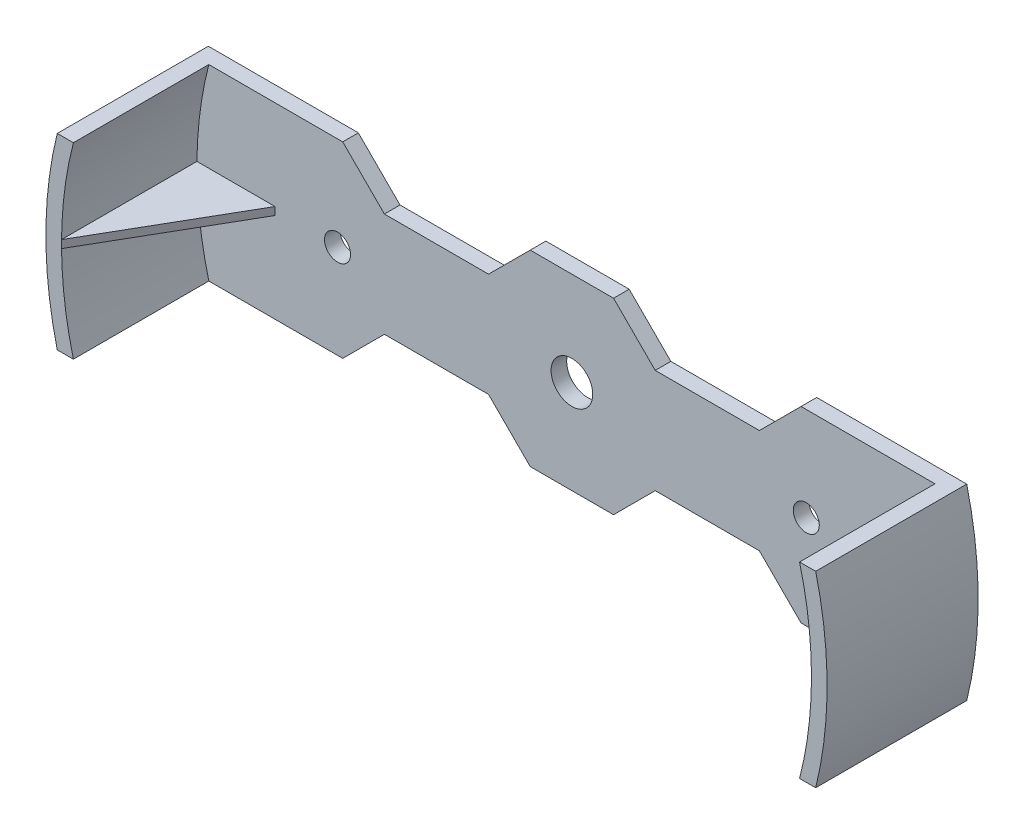
ISO-10303-21;
HEADER;
FILE_DESCRIPTION(('STEP AP214'),'2;1');
FILE_NAME('part.step','',(''),(''),'','','');
FILE_SCHEMA(('AUTOMOTIVE_DESIGN { 1 0 10303 214 1 1 1 1 }'));
ENDSEC;
DATA;
#1=APPLICATION_CONTEXT('core data for automotive mechanical design processes');
#2=APPLICATION_PROTOCOL_DEFINITION('international standard','automotive_design',2000,#1);
#3=PRODUCT_CONTEXT('',#1,'mechanical');
#4=PRODUCT('Part','Part','',(#3));
#5=PRODUCT_RELATED_PRODUCT_CATEGORY('part','',(#4));
#6=PRODUCT_DEFINITION_FORMATION('','',#4);
#7=PRODUCT_DEFINITION_CONTEXT('part definition',#1,'design');
#8=PRODUCT_DEFINITION('design','',#6,#7);
#9=PRODUCT_DEFINITION_SHAPE('','',#8);
#10=(LENGTH_UNIT() NAMED_UNIT(*) SI_UNIT(.MILLI.,.METRE.));
#11=(NAMED_UNIT(*) PLANE_ANGLE_UNIT() SI_UNIT($,.RADIAN.));
#12=(NAMED_UNIT(*) SI_UNIT($,.STERADIAN.) SOLID_ANGLE_UNIT());
#13=UNCERTAINTY_MEASURE_WITH_UNIT(LENGTH_MEASURE(1.E-05),#10,'distance_accuracy_value','');
#14=(GEOMETRIC_REPRESENTATION_CONTEXT(3) GLOBAL_UNCERTAINTY_ASSIGNED_CONTEXT((#13)) GLOBAL_UNIT_ASSIGNED_CONTEXT((#10,
#11,#12)) REPRESENTATION_CONTEXT('',''));
#15=CARTESIAN_POINT('',(0.,0.,0.));
#16=DIRECTION('',(0.,0.,1.));
#17=DIRECTION('',(1.,0.,0.));
#18=AXIS2_PLACEMENT_3D('',#15,#16,#17);
#19=CARTESIAN_POINT('',(0.,0.,29.));
#20=DIRECTION('',(0.,0.,-1.));
#21=DIRECTION('',(-1.,0.,0.));
#22=AXIS2_PLACEMENT_3D('',#19,#20,#21);
#23=CYLINDRICAL_SURFACE('',#22,72.);
#24=CARTESIAN_POINT('',(0.,0.,29.));
#25=DIRECTION('',(0.,0.,1.));
#26=DIRECTION('',(1.,0.,0.));
#27=AXIS2_PLACEMENT_3D('',#24,#25,#26);
#28=CIRCLE('',#27,72.);
#29=CARTESIAN_POINT('',(-69.7137002317335,18.,29.));
#30=VERTEX_POINT('',#29);
#31=CARTESIAN_POINT('',(-72.,0.,29.));
#32=VERTEX_POINT('',#31);
#33=EDGE_CURVE('E303',#30,#32,#28,.T.);
#34=ORIENTED_EDGE('',*,*,#33,.T.);
#35=CARTESIAN_POINT('',(0.,0.,-95.8));
#36=DIRECTION('',(-0.8661855860486,0.,-0.499722453489577));
#37=DIRECTION('',(0.499722453489577,0.,-0.866185586048601));
#38=AXIS2_PLACEMENT_3D('',#35,#36,#37);
#39=ELLIPSE('',#38,144.079977790115,72.);
#40=CARTESIAN_POINT('',(-71.9960936440305,0.75,28.9932289829861));
#41=VERTEX_POINT('',#40);
#42=EDGE_CURVE('E269',#32,#41,#39,.T.);
#43=ORIENTED_EDGE('',*,*,#42,.T.);
#44=DIRECTION('',(0.,0.,-1.));
#45=VECTOR('',#44,1.);
#46=CARTESIAN_POINT('',(-71.9960936440304,0.75,29.));
#47=LINE('',#46,#45);
#48=CARTESIAN_POINT('',(-71.9960936440305,0.75,3.));
#49=VERTEX_POINT('',#48);
#50=EDGE_CURVE('E262',#41,#49,#47,.T.);
#51=ORIENTED_EDGE('',*,*,#50,.T.);
#52=CARTESIAN_POINT('',(0.,0.,3.));
#53=DIRECTION('',(0.,0.,1.));
#54=DIRECTION('',(1.,0.,0.));
#55=AXIS2_PLACEMENT_3D('',#52,#53,#54);
#56=CIRCLE('',#55,72.);
#57=CARTESIAN_POINT('',(-69.7137002317335,18.,3.));
#58=VERTEX_POINT('',#57);
#59=EDGE_CURVE('E299',#58,#49,#56,.T.);
#60=ORIENTED_EDGE('',*,*,#59,.F.);
#61=DIRECTION('',(0.,0.,-1.));
#62=VECTOR('',#61,1.);
#63=CARTESIAN_POINT('',(-69.7137002317335,18.,29.));
#64=LINE('',#63,#62);
#65=EDGE_CURVE('E295',#30,#58,#64,.T.);
#66=ORIENTED_EDGE('',*,*,#65,.F.);
#67=EDGE_LOOP('',(#34,#43,#51,#60,#66));
#68=FACE_BOUND('',#67,.T.);
#69=ADVANCED_FACE('F38',(#68),#23,.F.);
#70=CARTESIAN_POINT('',(0.,0.,29.));
#71=DIRECTION('',(0.,0.,-1.));
#72=DIRECTION('',(-1.,0.,0.));
#73=AXIS2_PLACEMENT_3D('',#70,#71,#72);
#74=CYLINDRICAL_SURFACE('',#73,72.);
#75=DIRECTION('',(0.,0.,-1.));
#76=VECTOR('',#75,1.);
#77=CARTESIAN_POINT('',(71.9960936440304,-0.75,29.));
#78=LINE('',#77,#76);
#79=CARTESIAN_POINT('',(71.9960936440304,-0.75,3.));
#80=VERTEX_POINT('',#79);
#81=CARTESIAN_POINT('',(71.9960936440305,-0.75,28.9932289829861));
#82=VERTEX_POINT('',#81);
#83=EDGE_CURVE('E287',#80,#82,#78,.F.);
#84=ORIENTED_EDGE('',*,*,#83,.F.);
#85=CARTESIAN_POINT('',(0.,0.,3.));
#86=DIRECTION('',(0.,0.,1.));
#87=DIRECTION('',(1.,0.,0.));
#88=AXIS2_PLACEMENT_3D('',#85,#86,#87);
#89=CIRCLE('',#88,72.);
#90=CARTESIAN_POINT('',(69.7137002317335,-18.,3.));
#91=VERTEX_POINT('',#90);
#92=EDGE_CURVE('E329',#91,#80,#89,.T.);
#93=ORIENTED_EDGE('',*,*,#92,.F.);
#94=DIRECTION('',(0.,0.,-1.));
#95=VECTOR('',#94,1.);
#96=CARTESIAN_POINT('',(69.7137002317335,-18.,29.));
#97=LINE('',#96,#95);
#98=CARTESIAN_POINT('',(69.7137002317335,-18.,29.));
#99=VERTEX_POINT('',#98);
#100=EDGE_CURVE('E334',#99,#91,#97,.T.);
#101=ORIENTED_EDGE('',*,*,#100,.F.);
#102=CARTESIAN_POINT('',(0.,0.,29.));
#103=DIRECTION('',(0.,0.,1.));
#104=DIRECTION('',(1.,0.,0.));
#105=AXIS2_PLACEMENT_3D('',#102,#103,#104);
#106=CIRCLE('',#105,72.);
#107=CARTESIAN_POINT('',(72.,0.,29.));
#108=VERTEX_POINT('',#107);
#109=EDGE_CURVE('E315',#99,#108,#106,.T.);
#110=ORIENTED_EDGE('',*,*,#109,.T.);
#111=CARTESIAN_POINT('',(0.,0.,-95.8));
#112=DIRECTION('',(-0.8661855860486,0.,0.499722453489577));
#113=DIRECTION('',(-0.499722453489577,0.,-0.866185586048601));
#114=AXIS2_PLACEMENT_3D('',#111,#112,#113);
#115=ELLIPSE('',#114,144.079977790115,72.);
#116=EDGE_CURVE('E291',#82,#108,#115,.T.);
#117=ORIENTED_EDGE('',*,*,#116,.F.);
#118=EDGE_LOOP('',(#84,#93,#101,#110,#117));
#119=FACE_BOUND('',#118,.T.);
#120=ADVANCED_FACE('F593',(#119),#74,.F.);
#121=CARTESIAN_POINT('',(0.,0.,3.));
#122=DIRECTION('',(0.,0.,1.));
#123=DIRECTION('',(1.,0.,0.));
#124=AXIS2_PLACEMENT_3D('',#121,#122,#123);
#125=PLANE('',#124);
#126=DIRECTION('',(1.,0.,0.));
#127=VECTOR('',#126,1.);
#128=CARTESIAN_POINT('',(0.,-0.75,3.));
#129=LINE('',#128,#127);
#130=CARTESIAN_POINT('',(-71.9960936440304,-0.75,3.));
#131=VERTEX_POINT('',#130);
#132=CARTESIAN_POINT('',(-57.,-0.75,3.));
#133=VERTEX_POINT('',#132);
#134=EDGE_CURVE('E241',#131,#133,#129,.T.);
#135=ORIENTED_EDGE('',*,*,#134,.F.);
#136=CARTESIAN_POINT('',(-69.7137002317335,-18.,3.));
#137=VERTEX_POINT('',#136);
#138=EDGE_CURVE('E302',#131,#137,#56,.T.);
#139=ORIENTED_EDGE('',*,*,#138,.T.);
#140=DIRECTION('',(1.,0.,0.));
#141=VECTOR('',#140,1.);
#142=CARTESIAN_POINT('',(0.,-18.,3.));
#143=LINE('',#142,#141);
#144=CARTESIAN_POINT('',(-44.,-18.,3.));
#145=VERTEX_POINT('',#144);
#146=EDGE_CURVE('E349',#137,#145,#143,.T.);
#147=ORIENTED_EDGE('',*,*,#146,.T.);
#148=DIRECTION('',(-0.707106781186547,-0.707106781186548,0.));
#149=VECTOR('',#148,1.);
#150=CARTESIAN_POINT('',(-13.,13.,3.));
#151=LINE('',#150,#149);
#152=CARTESIAN_POINT('',(-36.,-10.,3.));
#153=VERTEX_POINT('',#152);
#154=EDGE_CURVE('E352',#153,#145,#151,.T.);
#155=ORIENTED_EDGE('',*,*,#154,.F.);
#156=DIRECTION('',(-1.,0.,0.));
#157=VECTOR('',#156,1.);
#158=CARTESIAN_POINT('',(0.,-10.,3.));
#159=LINE('',#158,#157);
#160=CARTESIAN_POINT('',(-16.,-10.,3.));
#161=VERTEX_POINT('',#160);
#162=EDGE_CURVE('E357',#161,#153,#159,.T.);
#163=ORIENTED_EDGE('',*,*,#162,.F.);
#164=DIRECTION('',(-0.707106781186547,0.707106781186548,0.));
#165=VECTOR('',#164,1.);
#166=CARTESIAN_POINT('',(-13.,-13.,3.));
#167=LINE('',#166,#165);
#168=CARTESIAN_POINT('',(-7.99999999999999,-18.,3.));
#169=VERTEX_POINT('',#168);
#170=EDGE_CURVE('E360',#169,#161,#167,.T.);
#171=ORIENTED_EDGE('',*,*,#170,.F.);
#172=CARTESIAN_POINT('',(7.99999999999999,-18.,3.));
#173=VERTEX_POINT('',#172);
#174=EDGE_CURVE('E354',#169,#173,#143,.T.);
#175=ORIENTED_EDGE('',*,*,#174,.T.);
#176=DIRECTION('',(0.707106781186547,0.707106781186548,0.));
#177=VECTOR('',#176,1.);
#178=CARTESIAN_POINT('',(13.,-13.,3.));
#179=LINE('',#178,#177);
#180=CARTESIAN_POINT('',(16.,-10.,3.));
#181=VERTEX_POINT('',#180);
#182=EDGE_CURVE('E363',#173,#181,#179,.T.);
#183=ORIENTED_EDGE('',*,*,#182,.T.);
#184=DIRECTION('',(1.,0.,0.));
#185=VECTOR('',#184,1.);
#186=CARTESIAN_POINT('',(0.,-10.,3.));
#187=LINE('',#186,#185);
#188=CARTESIAN_POINT('',(36.,-10.,3.));
#189=VERTEX_POINT('',#188);
#190=EDGE_CURVE('E366',#181,#189,#187,.T.);
#191=ORIENTED_EDGE('',*,*,#190,.T.);
#192=DIRECTION('',(0.707106781186547,-0.707106781186548,0.));
#193=VECTOR('',#192,1.);
#194=CARTESIAN_POINT('',(13.,13.,3.));
#195=LINE('',#194,#193);
#196=CARTESIAN_POINT('',(44.,-18.,3.));
#197=VERTEX_POINT('',#196);
#198=EDGE_CURVE('E369',#189,#197,#195,.T.);
#199=ORIENTED_EDGE('',*,*,#198,.T.);
#200=EDGE_CURVE('E353',#197,#91,#143,.T.);
#201=ORIENTED_EDGE('',*,*,#200,.T.);
#202=ORIENTED_EDGE('',*,*,#92,.T.);
#203=DIRECTION('',(-1.,0.,0.));
#204=VECTOR('',#203,1.);
#205=CARTESIAN_POINT('',(0.,-0.75,3.));
#206=LINE('',#205,#204);
#207=CARTESIAN_POINT('',(57.,-0.75,3.));
#208=VERTEX_POINT('',#207);
#209=EDGE_CURVE('E272',#80,#208,#206,.T.);
#210=ORIENTED_EDGE('',*,*,#209,.T.);
#211=DIRECTION('',(0.,1.,0.));
#212=VECTOR('',#211,1.);
#213=CARTESIAN_POINT('',(57.,-0.75,3.));
#214=LINE('',#213,#212);
#215=CARTESIAN_POINT('',(57.,0.75,3.));
#216=VERTEX_POINT('',#215);
#217=EDGE_CURVE('E278',#208,#216,#214,.T.);
#218=ORIENTED_EDGE('',*,*,#217,.T.);
#219=DIRECTION('',(-1.,0.,0.));
#220=VECTOR('',#219,1.);
#221=CARTESIAN_POINT('',(0.,0.75,3.));
#222=LINE('',#221,#220);
#223=CARTESIAN_POINT('',(71.9960936440304,0.75,3.));
#224=VERTEX_POINT('',#223);
#225=EDGE_CURVE('E279',#224,#216,#222,.T.);
#226=ORIENTED_EDGE('',*,*,#225,.F.);
#227=CARTESIAN_POINT('',(69.7137002317335,18.,3.));
#228=VERTEX_POINT('',#227);
#229=EDGE_CURVE('E301',#224,#228,#89,.T.);
#230=ORIENTED_EDGE('',*,*,#229,.T.);
#231=DIRECTION('',(1.,0.,0.));
#232=VECTOR('',#231,1.);
#233=CARTESIAN_POINT('',(0.,18.,3.));
#234=LINE('',#233,#232);
#235=CARTESIAN_POINT('',(44.,18.,3.));
#236=VERTEX_POINT('',#235);
#237=EDGE_CURVE('E372',#236,#228,#234,.T.);
#238=ORIENTED_EDGE('',*,*,#237,.F.);
#239=DIRECTION('',(0.707106781186546,0.707106781186549,0.));
#240=VECTOR('',#239,1.);
#241=CARTESIAN_POINT('',(13.0000000000001,-13.,3.));
#242=LINE('',#241,#240);
#243=CARTESIAN_POINT('',(36.,10.,3.));
#244=VERTEX_POINT('',#243);
#245=EDGE_CURVE('E375',#244,#236,#242,.T.);
#246=ORIENTED_EDGE('',*,*,#245,.F.);
#247=DIRECTION('',(1.,0.,0.));
#248=VECTOR('',#247,1.);
#249=CARTESIAN_POINT('',(0.,9.99999999999999,3.));
#250=LINE('',#249,#248);
#251=CARTESIAN_POINT('',(16.,10.,3.));
#252=VERTEX_POINT('',#251);
#253=EDGE_CURVE('E378',#252,#244,#250,.T.);
#254=ORIENTED_EDGE('',*,*,#253,.F.);
#255=DIRECTION('',(0.707106781186546,-0.707106781186549,0.));
#256=VECTOR('',#255,1.);
#257=CARTESIAN_POINT('',(13.,13.,3.));
#258=LINE('',#257,#256);
#259=CARTESIAN_POINT('',(7.99999999999999,18.,3.));
#260=VERTEX_POINT('',#259);
#261=EDGE_CURVE('E381',#260,#252,#258,.T.);
#262=ORIENTED_EDGE('',*,*,#261,.F.);
#263=DIRECTION('',(1.,0.,0.));
#264=VECTOR('',#263,1.);
#265=CARTESIAN_POINT('',(0.,18.,3.));
#266=LINE('',#265,#264);
#267=CARTESIAN_POINT('',(-7.99999999999999,18.,3.));
#268=VERTEX_POINT('',#267);
#269=EDGE_CURVE('E350',#268,#260,#266,.T.);
#270=ORIENTED_EDGE('',*,*,#269,.F.);
#271=DIRECTION('',(-0.707106781186547,-0.707106781186548,0.));
#272=VECTOR('',#271,1.);
#273=CARTESIAN_POINT('',(-13.,13.,3.));
#274=LINE('',#273,#272);
#275=CARTESIAN_POINT('',(-16.,9.99999999999999,3.));
#276=VERTEX_POINT('',#275);
#277=EDGE_CURVE('E384',#268,#276,#274,.T.);
#278=ORIENTED_EDGE('',*,*,#277,.T.);
#279=DIRECTION('',(-1.,0.,0.));
#280=VECTOR('',#279,1.);
#281=CARTESIAN_POINT('',(0.,10.,3.));
#282=LINE('',#281,#280);
#283=CARTESIAN_POINT('',(-36.,9.99999999999998,3.));
#284=VERTEX_POINT('',#283);
#285=EDGE_CURVE('E387',#276,#284,#282,.T.);
#286=ORIENTED_EDGE('',*,*,#285,.T.);
#287=DIRECTION('',(-0.707106781186547,0.707106781186548,0.));
#288=VECTOR('',#287,1.);
#289=CARTESIAN_POINT('',(-13.,-13.,3.));
#290=LINE('',#289,#288);
#291=CARTESIAN_POINT('',(-44.,18.,3.));
#292=VERTEX_POINT('',#291);
#293=EDGE_CURVE('E390',#284,#292,#290,.T.);
#294=ORIENTED_EDGE('',*,*,#293,.T.);
#295=EDGE_CURVE('E347',#58,#292,#266,.T.);
#296=ORIENTED_EDGE('',*,*,#295,.F.);
#297=ORIENTED_EDGE('',*,*,#59,.T.);
#298=DIRECTION('',(1.,0.,0.));
#299=VECTOR('',#298,1.);
#300=CARTESIAN_POINT('',(0.,0.75,3.));
#301=LINE('',#300,#299);
#302=CARTESIAN_POINT('',(-57.,0.75,3.));
#303=VERTEX_POINT('',#302);
#304=EDGE_CURVE('E53',#49,#303,#301,.T.);
#305=ORIENTED_EDGE('',*,*,#304,.T.);
#306=DIRECTION('',(0.,1.,0.));
#307=VECTOR('',#306,1.);
#308=CARTESIAN_POINT('',(-57.,-0.75,3.));
#309=LINE('',#308,#307);
#310=EDGE_CURVE('E255',#133,#303,#309,.T.);
#311=ORIENTED_EDGE('',*,*,#310,.F.);
#312=EDGE_LOOP('',(#135,#139,#147,#155,#163,#171,#175,#183,#191,#199,#201,#202,#210,#218,#226,
#230,#238,#246,#254,#262,#270,#278,#286,#294,#296,#297,#305,#311));
#313=FACE_BOUND('',#312,.T.);
#314=CARTESIAN_POINT('',(-45.,0.,3.));
#315=DIRECTION('',(0.,0.,1.));
#316=DIRECTION('',(1.,0.,0.));
#317=AXIS2_PLACEMENT_3D('',#314,#315,#316);
#318=CIRCLE('',#317,2.5);
#319=CARTESIAN_POINT('',(-42.5,0.,3.));
#320=VERTEX_POINT('',#319);
#321=EDGE_CURVE('E344',#320,#320,#318,.T.);
#322=ORIENTED_EDGE('',*,*,#321,.F.);
#323=EDGE_LOOP('',(#322));
#324=FACE_BOUND('',#323,.T.);
#325=CARTESIAN_POINT('',(45.,0.,3.));
#326=DIRECTION('',(0.,0.,1.));
#327=DIRECTION('',(1.,0.,0.));
#328=AXIS2_PLACEMENT_3D('',#325,#326,#327);
#329=CIRCLE('',#328,2.5);
#330=CARTESIAN_POINT('',(47.5,0.,3.));
#331=VERTEX_POINT('',#330);
#332=EDGE_CURVE('E340',#331,#331,#329,.T.);
#333=ORIENTED_EDGE('',*,*,#332,.F.);
#334=EDGE_LOOP('',(#333));
#335=FACE_BOUND('',#334,.T.);
#336=CARTESIAN_POINT('',(0.,0.,3.));
#337=DIRECTION('',(0.,0.,1.));
#338=DIRECTION('',(1.,0.,0.));
#339=AXIS2_PLACEMENT_3D('',#336,#337,#338);
#340=CIRCLE('',#339,4.);
#341=CARTESIAN_POINT('',(4.,0.,3.));
#342=VERTEX_POINT('',#341);
#343=EDGE_CURVE('E337',#342,#342,#340,.T.);
#344=ORIENTED_EDGE('',*,*,#343,.F.);
#345=EDGE_LOOP('',(#344));
#346=FACE_BOUND('',#345,.T.);
#347=ADVANCED_FACE('F259',(#313,#324,#335,#346),#125,.T.);
#348=CARTESIAN_POINT('',(0.,18.,3.));
#349=DIRECTION('',(0.,1.,0.));
#350=DIRECTION('',(0.,0.,1.));
#351=AXIS2_PLACEMENT_3D('',#348,#349,#350);
#352=PLANE('',#351);
#353=DIRECTION('',(1.,0.,0.));
#354=VECTOR('',#353,1.);
#355=CARTESIAN_POINT('',(0.,18.,0.));
#356=LINE('',#355,#354);
#357=CARTESIAN_POINT('',(-72.8079665970696,18.,0.));
#358=VERTEX_POINT('',#357);
#359=CARTESIAN_POINT('',(-44.,18.,0.));
#360=VERTEX_POINT('',#359);
#361=EDGE_CURVE('E402',#358,#360,#356,.T.);
#362=ORIENTED_EDGE('',*,*,#361,.F.);
#363=DIRECTION('',(0.,0.,-1.));
#364=VECTOR('',#363,1.);
#365=CARTESIAN_POINT('',(-72.8079665970696,18.,3.));
#366=LINE('',#365,#364);
#367=CARTESIAN_POINT('',(-72.8079665970696,18.,29.));
#368=VERTEX_POINT('',#367);
#369=EDGE_CURVE('E12',#368,#358,#366,.T.);
#370=ORIENTED_EDGE('',*,*,#369,.F.);
#371=DIRECTION('',(-1.,0.,0.));
#372=VECTOR('',#371,1.);
#373=CARTESIAN_POINT('',(-69.7137002317335,18.,29.));
#374=LINE('',#373,#372);
#375=EDGE_CURVE('E312',#30,#368,#374,.T.);
#376=ORIENTED_EDGE('',*,*,#375,.F.);
#377=ORIENTED_EDGE('',*,*,#65,.T.);
#378=ORIENTED_EDGE('',*,*,#295,.T.);
#379=DIRECTION('',(0.,0.,-1.));
#380=VECTOR('',#379,1.);
#381=CARTESIAN_POINT('',(-44.,18.,3.));
#382=LINE('',#381,#380);
#383=EDGE_CURVE('E393',#292,#360,#382,.T.);
#384=ORIENTED_EDGE('',*,*,#383,.T.);
#385=EDGE_LOOP('',(#362,#370,#376,#377,#378,#384));
#386=FACE_BOUND('',#385,.T.);
#387=ADVANCED_FACE('F508',(#386),#352,.T.);
#388=CARTESIAN_POINT('',(0.,0.,3.));
#389=DIRECTION('',(0.,0.,-1.));
#390=DIRECTION('',(-1.,0.,0.));
#391=AXIS2_PLACEMENT_3D('',#388,#389,#390);
#392=CYLINDRICAL_SURFACE('',#391,75.);
#393=CARTESIAN_POINT('',(0.,0.,0.));
#394=DIRECTION('',(0.,0.,1.));
#395=DIRECTION('',(1.,0.,0.));
#396=AXIS2_PLACEMENT_3D('',#393,#394,#395);
#397=CIRCLE('',#396,75.);
#398=CARTESIAN_POINT('',(-72.8079665970696,-18.,0.));
#399=VERTEX_POINT('',#398);
#400=EDGE_CURVE('E405',#358,#399,#397,.T.);
#401=ORIENTED_EDGE('',*,*,#400,.T.);
#402=DIRECTION('',(0.,0.,-1.));
#403=VECTOR('',#402,1.);
#404=CARTESIAN_POINT('',(-72.8079665970696,-18.,3.));
#405=LINE('',#404,#403);
#406=CARTESIAN_POINT('',(-72.8079665970696,-18.,29.));
#407=VERTEX_POINT('',#406);
#408=EDGE_CURVE('E46',#407,#399,#405,.T.);
#409=ORIENTED_EDGE('',*,*,#408,.F.);
#410=CARTESIAN_POINT('',(0.,0.,29.));
#411=DIRECTION('',(0.,0.,1.));
#412=DIRECTION('',(1.,0.,0.));
#413=AXIS2_PLACEMENT_3D('',#410,#411,#412);
#414=CIRCLE('',#413,75.);
#415=EDGE_CURVE('E309',#368,#407,#414,.T.);
#416=ORIENTED_EDGE('',*,*,#415,.F.);
#417=ORIENTED_EDGE('',*,*,#369,.T.);
#418=EDGE_LOOP('',(#401,#409,#416,#417));
#419=FACE_BOUND('',#418,.T.);
#420=ADVANCED_FACE('F503',(#419),#392,.T.);
#421=CARTESIAN_POINT('',(0.,-18.,3.));
#422=DIRECTION('',(0.,1.,0.));
#423=DIRECTION('',(0.,0.,1.));
#424=AXIS2_PLACEMENT_3D('',#421,#422,#423);
#425=PLANE('',#424);
#426=DIRECTION('',(1.,0.,0.));
#427=VECTOR('',#426,1.);
#428=CARTESIAN_POINT('',(0.,-18.,0.));
#429=LINE('',#428,#427);
#430=CARTESIAN_POINT('',(-44.,-18.,0.));
#431=VERTEX_POINT('',#430);
#432=EDGE_CURVE('E409',#399,#431,#429,.T.);
#433=ORIENTED_EDGE('',*,*,#432,.T.);
#434=DIRECTION('',(0.,0.,-1.));
#435=VECTOR('',#434,1.);
#436=CARTESIAN_POINT('',(-44.,-18.,3.));
#437=LINE('',#436,#435);
#438=EDGE_CURVE('E493',#145,#431,#437,.T.);
#439=ORIENTED_EDGE('',*,*,#438,.F.);
#440=ORIENTED_EDGE('',*,*,#146,.F.);
#441=DIRECTION('',(0.,0.,-1.));
#442=VECTOR('',#441,1.);
#443=CARTESIAN_POINT('',(-69.7137002317335,-18.,29.));
#444=LINE('',#443,#442);
#445=CARTESIAN_POINT('',(-69.7137002317335,-18.,29.));
#446=VERTEX_POINT('',#445);
#447=EDGE_CURVE('E292',#446,#137,#444,.T.);
#448=ORIENTED_EDGE('',*,*,#447,.F.);
#449=DIRECTION('',(1.,0.,0.));
#450=VECTOR('',#449,1.);
#451=CARTESIAN_POINT('',(-72.8079665970696,-18.,29.));
#452=LINE('',#451,#450);
#453=EDGE_CURVE('E306',#407,#446,#452,.T.);
#454=ORIENTED_EDGE('',*,*,#453,.F.);
#455=ORIENTED_EDGE('',*,*,#408,.T.);
#456=EDGE_LOOP('',(#433,#439,#440,#448,#454,#455));
#457=FACE_BOUND('',#456,.T.);
#458=ADVANCED_FACE('F497',(#457),#425,.F.);
#459=CARTESIAN_POINT('',(-13.,13.,3.));
#460=DIRECTION('',(0.707106781186548,-0.707106781186547,0.));
#461=DIRECTION('',(0.707106781186547,0.707106781186548,0.));
#462=AXIS2_PLACEMENT_3D('',#459,#460,#461);
#463=PLANE('',#462);
#464=DIRECTION('',(-0.707106781186547,-0.707106781186548,0.));
#465=VECTOR('',#464,1.);
#466=CARTESIAN_POINT('',(-13.,13.,0.));
#467=LINE('',#466,#465);
#468=CARTESIAN_POINT('',(-36.,-10.,0.));
#469=VERTEX_POINT('',#468);
#470=EDGE_CURVE('E413',#469,#431,#467,.T.);
#471=ORIENTED_EDGE('',*,*,#470,.F.);
#472=DIRECTION('',(0.,0.,-1.));
#473=VECTOR('',#472,1.);
#474=CARTESIAN_POINT('',(-36.,-10.,3.));
#475=LINE('',#474,#473);
#476=EDGE_CURVE('E491',#153,#469,#475,.T.);
#477=ORIENTED_EDGE('',*,*,#476,.F.);
#478=ORIENTED_EDGE('',*,*,#154,.T.);
#479=ORIENTED_EDGE('',*,*,#438,.T.);
#480=EDGE_LOOP('',(#471,#477,#478,#479));
#481=FACE_BOUND('',#480,.T.);
#482=ADVANCED_FACE('F567',(#481),#463,.T.);
#483=CARTESIAN_POINT('',(0.,-10.,3.));
#484=DIRECTION('',(0.,-1.,0.));
#485=DIRECTION('',(1.,0.,0.));
#486=AXIS2_PLACEMENT_3D('',#483,#484,#485);
#487=PLANE('',#486);
#488=DIRECTION('',(-1.,0.,0.));
#489=VECTOR('',#488,1.);
#490=CARTESIAN_POINT('',(0.,-10.,0.));
#491=LINE('',#490,#489);
#492=CARTESIAN_POINT('',(-16.,-10.,0.));
#493=VERTEX_POINT('',#492);
#494=EDGE_CURVE('E418',#493,#469,#491,.T.);
#495=ORIENTED_EDGE('',*,*,#494,.F.);
#496=DIRECTION('',(0.,0.,-1.));
#497=VECTOR('',#496,1.);
#498=CARTESIAN_POINT('',(-16.,-10.,3.));
#499=LINE('',#498,#497);
#500=EDGE_CURVE('E489',#161,#493,#499,.T.);
#501=ORIENTED_EDGE('',*,*,#500,.F.);
#502=ORIENTED_EDGE('',*,*,#162,.T.);
#503=ORIENTED_EDGE('',*,*,#476,.T.);
#504=EDGE_LOOP('',(#495,#501,#502,#503));
#505=FACE_BOUND('',#504,.T.);
#506=ADVANCED_FACE('F564',(#505),#487,.T.);
#507=CARTESIAN_POINT('',(-13.,-13.,3.));
#508=DIRECTION('',(-0.707106781186548,-0.707106781186547,0.));
#509=DIRECTION('',(0.707106781186547,-0.707106781186548,0.));
#510=AXIS2_PLACEMENT_3D('',#507,#508,#509);
#511=PLANE('',#510);
#512=DIRECTION('',(-0.707106781186547,0.707106781186548,0.));
#513=VECTOR('',#512,1.);
#514=CARTESIAN_POINT('',(-13.,-13.,0.));
#515=LINE('',#514,#513);
#516=CARTESIAN_POINT('',(-7.99999999999999,-18.,0.));
#517=VERTEX_POINT('',#516);
#518=EDGE_CURVE('E421',#517,#493,#515,.T.);
#519=ORIENTED_EDGE('',*,*,#518,.F.);
#520=DIRECTION('',(0.,0.,-1.));
#521=VECTOR('',#520,1.);
#522=CARTESIAN_POINT('',(-7.99999999999999,-18.,3.));
#523=LINE('',#522,#521);
#524=EDGE_CURVE('E487',#169,#517,#523,.T.);
#525=ORIENTED_EDGE('',*,*,#524,.F.);
#526=ORIENTED_EDGE('',*,*,#170,.T.);
#527=ORIENTED_EDGE('',*,*,#500,.T.);
#528=EDGE_LOOP('',(#519,#525,#526,#527));
#529=FACE_BOUND('',#528,.T.);
#530=ADVANCED_FACE('F559',(#529),#511,.T.);
#531=CARTESIAN_POINT('',(7.99999999999999,-18.,0.));
#532=VERTEX_POINT('',#531);
#533=EDGE_CURVE('E415',#517,#532,#429,.T.);
#534=ORIENTED_EDGE('',*,*,#533,.T.);
#535=DIRECTION('',(0.,0.,-1.));
#536=VECTOR('',#535,1.);
#537=CARTESIAN_POINT('',(7.99999999999999,-18.,3.));
#538=LINE('',#537,#536);
#539=EDGE_CURVE('E484',#173,#532,#538,.T.);
#540=ORIENTED_EDGE('',*,*,#539,.F.);
#541=ORIENTED_EDGE('',*,*,#174,.F.);
#542=ORIENTED_EDGE('',*,*,#524,.T.);
#543=EDGE_LOOP('',(#534,#540,#541,#542));
#544=FACE_BOUND('',#543,.T.);
#545=ADVANCED_FACE('F555',(#544),#425,.F.);
#546=CARTESIAN_POINT('',(13.,-13.,3.));
#547=DIRECTION('',(-0.707106781186548,0.707106781186547,0.));
#548=DIRECTION('',(-0.707106781186547,-0.707106781186548,0.));
#549=AXIS2_PLACEMENT_3D('',#546,#547,#548);
#550=PLANE('',#549);
#551=DIRECTION('',(0.707106781186547,0.707106781186548,0.));
#552=VECTOR('',#551,1.);
#553=CARTESIAN_POINT('',(13.,-13.,0.));
#554=LINE('',#553,#552);
#555=CARTESIAN_POINT('',(16.,-10.,0.));
#556=VERTEX_POINT('',#555);
#557=EDGE_CURVE('E424',#532,#556,#554,.T.);
#558=ORIENTED_EDGE('',*,*,#557,.T.);
#559=DIRECTION('',(0.,0.,-1.));
#560=VECTOR('',#559,1.);
#561=CARTESIAN_POINT('',(16.,-10.,3.));
#562=LINE('',#561,#560);
#563=EDGE_CURVE('E481',#181,#556,#562,.T.);
#564=ORIENTED_EDGE('',*,*,#563,.F.);
#565=ORIENTED_EDGE('',*,*,#182,.F.);
#566=ORIENTED_EDGE('',*,*,#539,.T.);
#567=EDGE_LOOP('',(#558,#564,#565,#566));
#568=FACE_BOUND('',#567,.T.);
#569=ADVANCED_FACE('F600',(#568),#550,.F.);
#570=CARTESIAN_POINT('',(0.,-10.,3.));
#571=DIRECTION('',(0.,1.,0.));
#572=DIRECTION('',(-1.,0.,0.));
#573=AXIS2_PLACEMENT_3D('',#570,#571,#572);
#574=PLANE('',#573);
#575=DIRECTION('',(1.,0.,0.));
#576=VECTOR('',#575,1.);
#577=CARTESIAN_POINT('',(0.,-10.,0.));
#578=LINE('',#577,#576);
#579=CARTESIAN_POINT('',(36.,-10.,0.));
#580=VERTEX_POINT('',#579);
#581=EDGE_CURVE('E427',#556,#580,#578,.T.);
#582=ORIENTED_EDGE('',*,*,#581,.T.);
#583=DIRECTION('',(0.,0.,-1.));
#584=VECTOR('',#583,1.);
#585=CARTESIAN_POINT('',(36.,-10.,3.));
#586=LINE('',#585,#584);
#587=EDGE_CURVE('E478',#189,#580,#586,.T.);
#588=ORIENTED_EDGE('',*,*,#587,.F.);
#589=ORIENTED_EDGE('',*,*,#190,.F.);
#590=ORIENTED_EDGE('',*,*,#563,.T.);
#591=EDGE_LOOP('',(#582,#588,#589,#590));
#592=FACE_BOUND('',#591,.T.);
#593=ADVANCED_FACE('F602',(#592),#574,.F.);
#594=CARTESIAN_POINT('',(13.,13.,3.));
#595=DIRECTION('',(0.707106781186548,0.707106781186547,0.));
#596=DIRECTION('',(-0.707106781186547,0.707106781186548,0.));
#597=AXIS2_PLACEMENT_3D('',#594,#595,#596);
#598=PLANE('',#597);
#599=DIRECTION('',(0.707106781186547,-0.707106781186548,0.));
#600=VECTOR('',#599,1.);
#601=CARTESIAN_POINT('',(13.,13.,0.));
#602=LINE('',#601,#600);
#603=CARTESIAN_POINT('',(44.,-18.,0.));
#604=VERTEX_POINT('',#603);
#605=EDGE_CURVE('E430',#580,#604,#602,.T.);
#606=ORIENTED_EDGE('',*,*,#605,.T.);
#607=DIRECTION('',(0.,0.,-1.));
#608=VECTOR('',#607,1.);
#609=CARTESIAN_POINT('',(44.,-18.,3.));
#610=LINE('',#609,#608);
#611=EDGE_CURVE('E475',#197,#604,#610,.T.);
#612=ORIENTED_EDGE('',*,*,#611,.F.);
#613=ORIENTED_EDGE('',*,*,#198,.F.);
#614=ORIENTED_EDGE('',*,*,#587,.T.);
#615=EDGE_LOOP('',(#606,#612,#613,#614));
#616=FACE_BOUND('',#615,.T.);
#617=ADVANCED_FACE('F604',(#616),#598,.F.);
#618=CARTESIAN_POINT('',(72.8079665970696,-18.,0.));
#619=VERTEX_POINT('',#618);
#620=EDGE_CURVE('E414',#604,#619,#429,.T.);
#621=ORIENTED_EDGE('',*,*,#620,.T.);
#622=DIRECTION('',(0.,0.,-1.));
#623=VECTOR('',#622,1.);
#624=CARTESIAN_POINT('',(72.8079665970696,-18.,3.));
#625=LINE('',#624,#623);
#626=CARTESIAN_POINT('',(72.8079665970696,-18.,29.));
#627=VERTEX_POINT('',#626);
#628=EDGE_CURVE('E472',#627,#619,#625,.T.);
#629=ORIENTED_EDGE('',*,*,#628,.F.);
#630=DIRECTION('',(1.,0.,0.));
#631=VECTOR('',#630,1.);
#632=CARTESIAN_POINT('',(0.,-18.,29.));
#633=LINE('',#632,#631);
#634=EDGE_CURVE('E318',#99,#627,#633,.T.);
#635=ORIENTED_EDGE('',*,*,#634,.F.);
#636=ORIENTED_EDGE('',*,*,#100,.T.);
#637=ORIENTED_EDGE('',*,*,#200,.F.);
#638=ORIENTED_EDGE('',*,*,#611,.T.);
#639=EDGE_LOOP('',(#621,#629,#635,#636,#637,#638));
#640=FACE_BOUND('',#639,.T.);
#641=ADVANCED_FACE('F588',(#640),#425,.F.);
#642=CARTESIAN_POINT('',(72.8079665970696,18.,0.));
#643=VERTEX_POINT('',#642);
#644=EDGE_CURVE('E410',#619,#643,#397,.T.);
#645=ORIENTED_EDGE('',*,*,#644,.T.);
#646=DIRECTION('',(0.,0.,-1.));
#647=VECTOR('',#646,1.);
#648=CARTESIAN_POINT('',(72.8079665970696,18.,3.));
#649=LINE('',#648,#647);
#650=CARTESIAN_POINT('',(72.8079665970696,18.,29.));
#651=VERTEX_POINT('',#650);
#652=EDGE_CURVE('E470',#651,#643,#649,.T.);
#653=ORIENTED_EDGE('',*,*,#652,.F.);
#654=CARTESIAN_POINT('',(0.,0.,29.));
#655=DIRECTION('',(0.,0.,1.));
#656=DIRECTION('',(1.,0.,0.));
#657=AXIS2_PLACEMENT_3D('',#654,#655,#656);
#658=CIRCLE('',#657,75.);
#659=EDGE_CURVE('E322',#627,#651,#658,.T.);
#660=ORIENTED_EDGE('',*,*,#659,.F.);
#661=ORIENTED_EDGE('',*,*,#628,.T.);
#662=EDGE_LOOP('',(#645,#653,#660,#661));
#663=FACE_BOUND('',#662,.T.);
#664=ADVANCED_FACE('F548',(#663),#392,.T.);
#665=CARTESIAN_POINT('',(0.,18.,3.));
#666=DIRECTION('',(0.,1.,0.));
#667=DIRECTION('',(-1.,0.,0.));
#668=AXIS2_PLACEMENT_3D('',#665,#666,#667);
#669=PLANE('',#668);
#670=DIRECTION('',(1.,0.,0.));
#671=VECTOR('',#670,1.);
#672=CARTESIAN_POINT('',(0.,18.,0.));
#673=LINE('',#672,#671);
#674=CARTESIAN_POINT('',(44.,18.,0.));
#675=VERTEX_POINT('',#674);
#676=EDGE_CURVE('E433',#675,#643,#673,.T.);
#677=ORIENTED_EDGE('',*,*,#676,.F.);
#678=DIRECTION('',(0.,0.,-1.));
#679=VECTOR('',#678,1.);
#680=CARTESIAN_POINT('',(44.,18.,3.));
#681=LINE('',#680,#679);
#682=EDGE_CURVE('E468',#236,#675,#681,.T.);
#683=ORIENTED_EDGE('',*,*,#682,.F.);
#684=ORIENTED_EDGE('',*,*,#237,.T.);
#685=DIRECTION('',(0.,0.,-1.));
#686=VECTOR('',#685,1.);
#687=CARTESIAN_POINT('',(69.7137002317335,18.,29.));
#688=LINE('',#687,#686);
#689=CARTESIAN_POINT('',(69.7137002317335,18.,29.));
#690=VERTEX_POINT('',#689);
#691=EDGE_CURVE('E328',#690,#228,#688,.T.);
#692=ORIENTED_EDGE('',*,*,#691,.F.);
#693=DIRECTION('',(-1.,0.,0.));
#694=VECTOR('',#693,1.);
#695=CARTESIAN_POINT('',(0.,18.,29.));
#696=LINE('',#695,#694);
#697=EDGE_CURVE('E325',#651,#690,#696,.T.);
#698=ORIENTED_EDGE('',*,*,#697,.F.);
#699=ORIENTED_EDGE('',*,*,#652,.T.);
#700=EDGE_LOOP('',(#677,#683,#684,#692,#698,#699));
#701=FACE_BOUND('',#700,.T.);
#702=ADVANCED_FACE('F542',(#701),#669,.T.);
#703=CARTESIAN_POINT('',(13.0000000000001,-13.,3.));
#704=DIRECTION('',(-0.707106781186548,0.707106781186546,0.));
#705=DIRECTION('',(-0.707106781186546,-0.707106781186549,0.));
#706=AXIS2_PLACEMENT_3D('',#703,#704,#705);
#707=PLANE('',#706);
#708=DIRECTION('',(0.707106781186546,0.707106781186549,0.));
#709=VECTOR('',#708,1.);
#710=CARTESIAN_POINT('',(13.0000000000001,-13.,0.));
#711=LINE('',#710,#709);
#712=CARTESIAN_POINT('',(36.,10.,0.));
#713=VERTEX_POINT('',#712);
#714=EDGE_CURVE('E436',#713,#675,#711,.T.);
#715=ORIENTED_EDGE('',*,*,#714,.F.);
#716=DIRECTION('',(0.,0.,-1.));
#717=VECTOR('',#716,1.);
#718=CARTESIAN_POINT('',(36.,10.,3.));
#719=LINE('',#718,#717);
#720=EDGE_CURVE('E466',#244,#713,#719,.T.);
#721=ORIENTED_EDGE('',*,*,#720,.F.);
#722=ORIENTED_EDGE('',*,*,#245,.T.);
#723=ORIENTED_EDGE('',*,*,#682,.T.);
#724=EDGE_LOOP('',(#715,#721,#722,#723));
#725=FACE_BOUND('',#724,.T.);
#726=ADVANCED_FACE('F538',(#725),#707,.T.);
#727=CARTESIAN_POINT('',(0.,9.99999999999999,3.));
#728=DIRECTION('',(0.,1.,0.));
#729=DIRECTION('',(-1.,0.,0.));
#730=AXIS2_PLACEMENT_3D('',#727,#728,#729);
#731=PLANE('',#730);
#732=DIRECTION('',(1.,0.,0.));
#733=VECTOR('',#732,1.);
#734=CARTESIAN_POINT('',(0.,9.99999999999999,0.));
#735=LINE('',#734,#733);
#736=CARTESIAN_POINT('',(16.,10.,0.));
#737=VERTEX_POINT('',#736);
#738=EDGE_CURVE('E439',#737,#713,#735,.T.);
#739=ORIENTED_EDGE('',*,*,#738,.F.);
#740=DIRECTION('',(0.,0.,-1.));
#741=VECTOR('',#740,1.);
#742=CARTESIAN_POINT('',(16.,10.,3.));
#743=LINE('',#742,#741);
#744=EDGE_CURVE('E464',#252,#737,#743,.T.);
#745=ORIENTED_EDGE('',*,*,#744,.F.);
#746=ORIENTED_EDGE('',*,*,#253,.T.);
#747=ORIENTED_EDGE('',*,*,#720,.T.);
#748=EDGE_LOOP('',(#739,#745,#746,#747));
#749=FACE_BOUND('',#748,.T.);
#750=ADVANCED_FACE('F534',(#749),#731,.T.);
#751=CARTESIAN_POINT('',(13.,13.,3.));
#752=DIRECTION('',(0.707106781186548,0.707106781186546,0.));
#753=DIRECTION('',(-0.707106781186546,0.707106781186549,0.));
#754=AXIS2_PLACEMENT_3D('',#751,#752,#753);
#755=PLANE('',#754);
#756=DIRECTION('',(0.707106781186546,-0.707106781186549,0.));
#757=VECTOR('',#756,1.);
#758=CARTESIAN_POINT('',(13.,13.,0.));
#759=LINE('',#758,#757);
#760=CARTESIAN_POINT('',(7.99999999999999,18.,0.));
#761=VERTEX_POINT('',#760);
#762=EDGE_CURVE('E442',#761,#737,#759,.T.);
#763=ORIENTED_EDGE('',*,*,#762,.F.);
#764=DIRECTION('',(0.,0.,-1.));
#765=VECTOR('',#764,1.);
#766=CARTESIAN_POINT('',(7.99999999999999,18.,3.));
#767=LINE('',#766,#765);
#768=EDGE_CURVE('E462',#260,#761,#767,.T.);
#769=ORIENTED_EDGE('',*,*,#768,.F.);
#770=ORIENTED_EDGE('',*,*,#261,.T.);
#771=ORIENTED_EDGE('',*,*,#744,.T.);
#772=EDGE_LOOP('',(#763,#769,#770,#771));
#773=FACE_BOUND('',#772,.T.);
#774=ADVANCED_FACE('F530',(#773),#755,.T.);
#775=CARTESIAN_POINT('',(-7.99999999999999,18.,0.));
#776=VERTEX_POINT('',#775);
#777=EDGE_CURVE('E406',#776,#761,#356,.T.);
#778=ORIENTED_EDGE('',*,*,#777,.F.);
#779=DIRECTION('',(0.,0.,-1.));
#780=VECTOR('',#779,1.);
#781=CARTESIAN_POINT('',(-7.99999999999999,18.,3.));
#782=LINE('',#781,#780);
#783=EDGE_CURVE('E460',#268,#776,#782,.T.);
#784=ORIENTED_EDGE('',*,*,#783,.F.);
#785=ORIENTED_EDGE('',*,*,#269,.T.);
#786=ORIENTED_EDGE('',*,*,#768,.T.);
#787=EDGE_LOOP('',(#778,#784,#785,#786));
#788=FACE_BOUND('',#787,.T.);
#789=ADVANCED_FACE('F526',(#788),#352,.T.);
#790=CARTESIAN_POINT('',(-13.,13.,3.));
#791=DIRECTION('',(0.707106781186548,-0.707106781186547,0.));
#792=DIRECTION('',(0.707106781186547,0.707106781186548,0.));
#793=AXIS2_PLACEMENT_3D('',#790,#791,#792);
#794=PLANE('',#793);
#795=DIRECTION('',(-0.707106781186547,-0.707106781186548,0.));
#796=VECTOR('',#795,1.);
#797=CARTESIAN_POINT('',(-13.,13.,0.));
#798=LINE('',#797,#796);
#799=CARTESIAN_POINT('',(-16.,9.99999999999999,0.));
#800=VERTEX_POINT('',#799);
#801=EDGE_CURVE('E445',#776,#800,#798,.T.);
#802=ORIENTED_EDGE('',*,*,#801,.T.);
#803=DIRECTION('',(0.,0.,-1.));
#804=VECTOR('',#803,1.);
#805=CARTESIAN_POINT('',(-16.,9.99999999999999,3.));
#806=LINE('',#805,#804);
#807=EDGE_CURVE('E457',#276,#800,#806,.T.);
#808=ORIENTED_EDGE('',*,*,#807,.F.);
#809=ORIENTED_EDGE('',*,*,#277,.F.);
#810=ORIENTED_EDGE('',*,*,#783,.T.);
#811=EDGE_LOOP('',(#802,#808,#809,#810));
#812=FACE_BOUND('',#811,.T.);
#813=ADVANCED_FACE('F522',(#812),#794,.F.);
#814=CARTESIAN_POINT('',(0.,10.,3.));
#815=DIRECTION('',(0.,-1.,0.));
#816=DIRECTION('',(1.,0.,0.));
#817=AXIS2_PLACEMENT_3D('',#814,#815,#816);
#818=PLANE('',#817);
#819=DIRECTION('',(-1.,0.,0.));
#820=VECTOR('',#819,1.);
#821=CARTESIAN_POINT('',(0.,10.,0.));
#822=LINE('',#821,#820);
#823=CARTESIAN_POINT('',(-36.,9.99999999999998,0.));
#824=VERTEX_POINT('',#823);
#825=EDGE_CURVE('E448',#800,#824,#822,.T.);
#826=ORIENTED_EDGE('',*,*,#825,.T.);
#827=DIRECTION('',(0.,0.,-1.));
#828=VECTOR('',#827,1.);
#829=CARTESIAN_POINT('',(-36.,9.99999999999998,3.));
#830=LINE('',#829,#828);
#831=EDGE_CURVE('E454',#284,#824,#830,.T.);
#832=ORIENTED_EDGE('',*,*,#831,.F.);
#833=ORIENTED_EDGE('',*,*,#285,.F.);
#834=ORIENTED_EDGE('',*,*,#807,.T.);
#835=EDGE_LOOP('',(#826,#832,#833,#834));
#836=FACE_BOUND('',#835,.T.);
#837=ADVANCED_FACE('F519',(#836),#818,.F.);
#838=CARTESIAN_POINT('',(-45.,0.,3.));
#839=DIRECTION('',(0.,0.,-1.));
#840=DIRECTION('',(-1.,0.,0.));
#841=AXIS2_PLACEMENT_3D('',#838,#839,#840);
#842=CYLINDRICAL_SURFACE('',#841,2.5);
#843=ORIENTED_EDGE('',*,*,#321,.T.);
#844=EDGE_LOOP('',(#843));
#845=FACE_BOUND('',#844,.T.);
#846=CARTESIAN_POINT('',(-45.,0.,0.));
#847=DIRECTION('',(0.,0.,1.));
#848=DIRECTION('',(1.,0.,0.));
#849=AXIS2_PLACEMENT_3D('',#846,#847,#848);
#850=CIRCLE('',#849,2.5);
#851=CARTESIAN_POINT('',(-42.5,0.,0.));
#852=VERTEX_POINT('',#851);
#853=EDGE_CURVE('E399',#852,#852,#850,.T.);
#854=ORIENTED_EDGE('',*,*,#853,.F.);
#855=EDGE_LOOP('',(#854));
#856=FACE_BOUND('',#855,.T.);
#857=ADVANCED_FACE('F641',(#845,#856),#842,.F.);
#858=CARTESIAN_POINT('',(45.,0.,3.));
#859=DIRECTION('',(0.,0.,-1.));
#860=DIRECTION('',(-1.,0.,0.));
#861=AXIS2_PLACEMENT_3D('',#858,#859,#860);
#862=CYLINDRICAL_SURFACE('',#861,2.5);
#863=ORIENTED_EDGE('',*,*,#332,.T.);
#864=EDGE_LOOP('',(#863));
#865=FACE_BOUND('',#864,.T.);
#866=CARTESIAN_POINT('',(45.,0.,0.));
#867=DIRECTION('',(0.,0.,1.));
#868=DIRECTION('',(1.,0.,0.));
#869=AXIS2_PLACEMENT_3D('',#866,#867,#868);
#870=CIRCLE('',#869,2.5);
#871=CARTESIAN_POINT('',(47.5,0.,0.));
#872=VERTEX_POINT('',#871);
#873=EDGE_CURVE('E396',#872,#872,#870,.T.);
#874=ORIENTED_EDGE('',*,*,#873,.F.);
#875=EDGE_LOOP('',(#874));
#876=FACE_BOUND('',#875,.T.);
#877=ADVANCED_FACE('F741',(#865,#876),#862,.F.);
#878=CARTESIAN_POINT('',(0.,0.,3.));
#879=DIRECTION('',(0.,0.,-1.));
#880=DIRECTION('',(-1.,0.,0.));
#881=AXIS2_PLACEMENT_3D('',#878,#879,#880);
#882=CYLINDRICAL_SURFACE('',#881,4.);
#883=ORIENTED_EDGE('',*,*,#343,.T.);
#884=EDGE_LOOP('',(#883));
#885=FACE_BOUND('',#884,.T.);
#886=CARTESIAN_POINT('',(0.,0.,0.));
#887=DIRECTION('',(0.,0.,1.));
#888=DIRECTION('',(1.,0.,0.));
#889=AXIS2_PLACEMENT_3D('',#886,#887,#888);
#890=CIRCLE('',#889,4.);
#891=CARTESIAN_POINT('',(4.,0.,0.));
#892=VERTEX_POINT('',#891);
#893=EDGE_CURVE('E336',#892,#892,#890,.T.);
#894=ORIENTED_EDGE('',*,*,#893,.F.);
#895=EDGE_LOOP('',(#894));
#896=FACE_BOUND('',#895,.T.);
#897=ADVANCED_FACE('F40',(#885,#896),#882,.F.);
#898=CARTESIAN_POINT('',(-13.,-13.,3.));
#899=DIRECTION('',(-0.707106781186548,-0.707106781186547,0.));
#900=DIRECTION('',(0.707106781186547,-0.707106781186548,0.));
#901=AXIS2_PLACEMENT_3D('',#898,#899,#900);
#902=PLANE('',#901);
#903=DIRECTION('',(-0.707106781186547,0.707106781186548,0.));
#904=VECTOR('',#903,1.);
#905=CARTESIAN_POINT('',(-13.,-13.,0.));
#906=LINE('',#905,#904);
#907=EDGE_CURVE('E341',#824,#360,#906,.T.);
#908=ORIENTED_EDGE('',*,*,#907,.T.);
#909=ORIENTED_EDGE('',*,*,#383,.F.);
#910=ORIENTED_EDGE('',*,*,#293,.F.);
#911=ORIENTED_EDGE('',*,*,#831,.T.);
#912=EDGE_LOOP('',(#908,#909,#910,#911));
#913=FACE_BOUND('',#912,.T.);
#914=ADVANCED_FACE('F512',(#913),#902,.F.);
#915=CARTESIAN_POINT('',(0.,0.,0.));
#916=DIRECTION('',(0.,0.,1.));
#917=DIRECTION('',(1.,0.,0.));
#918=AXIS2_PLACEMENT_3D('',#915,#916,#917);
#919=PLANE('',#918);
#920=ORIENTED_EDGE('',*,*,#893,.T.);
#921=EDGE_LOOP('',(#920));
#922=FACE_BOUND('',#921,.T.);
#923=ORIENTED_EDGE('',*,*,#873,.T.);
#924=EDGE_LOOP('',(#923));
#925=FACE_BOUND('',#924,.T.);
#926=ORIENTED_EDGE('',*,*,#853,.T.);
#927=EDGE_LOOP('',(#926));
#928=FACE_BOUND('',#927,.T.);
#929=ORIENTED_EDGE('',*,*,#361,.T.);
#930=ORIENTED_EDGE('',*,*,#907,.F.);
#931=ORIENTED_EDGE('',*,*,#825,.F.);
#932=ORIENTED_EDGE('',*,*,#801,.F.);
#933=ORIENTED_EDGE('',*,*,#777,.T.);
#934=ORIENTED_EDGE('',*,*,#762,.T.);
#935=ORIENTED_EDGE('',*,*,#738,.T.);
#936=ORIENTED_EDGE('',*,*,#714,.T.);
#937=ORIENTED_EDGE('',*,*,#676,.T.);
#938=ORIENTED_EDGE('',*,*,#644,.F.);
#939=ORIENTED_EDGE('',*,*,#620,.F.);
#940=ORIENTED_EDGE('',*,*,#605,.F.);
#941=ORIENTED_EDGE('',*,*,#581,.F.);
#942=ORIENTED_EDGE('',*,*,#557,.F.);
#943=ORIENTED_EDGE('',*,*,#533,.F.);
#944=ORIENTED_EDGE('',*,*,#518,.T.);
#945=ORIENTED_EDGE('',*,*,#494,.T.);
#946=ORIENTED_EDGE('',*,*,#470,.T.);
#947=ORIENTED_EDGE('',*,*,#432,.F.);
#948=ORIENTED_EDGE('',*,*,#400,.F.);
#949=EDGE_LOOP('',(#929,#930,#931,#932,#933,#934,#935,#936,#937,#938,#939,#940,#941,#942,#943,
#944,#945,#946,#947,#948));
#950=FACE_BOUND('',#949,.T.);
#951=ADVANCED_FACE('F506',(#922,#925,#928,#950),#919,.F.);
#952=CARTESIAN_POINT('',(71.9960936440305,0.75,28.9932289829861));
#953=VERTEX_POINT('',#952);
#954=EDGE_CURVE('E289',#108,#953,#115,.T.);
#955=ORIENTED_EDGE('',*,*,#954,.F.);
#956=EDGE_CURVE('E319',#108,#690,#106,.T.);
#957=ORIENTED_EDGE('',*,*,#956,.T.);
#958=ORIENTED_EDGE('',*,*,#691,.T.);
#959=ORIENTED_EDGE('',*,*,#229,.F.);
#960=DIRECTION('',(0.,0.,-1.));
#961=VECTOR('',#960,1.);
#962=CARTESIAN_POINT('',(71.9960936440304,0.75,29.));
#963=LINE('',#962,#961);
#964=EDGE_CURVE('E284',#224,#953,#963,.F.);
#965=ORIENTED_EDGE('',*,*,#964,.T.);
#966=EDGE_LOOP('',(#955,#957,#958,#959,#965));
#967=FACE_BOUND('',#966,.T.);
#968=ADVANCED_FACE('F582',(#967),#74,.F.);
#969=CARTESIAN_POINT('',(0.,0.,29.));
#970=DIRECTION('',(0.,0.,1.));
#971=DIRECTION('',(1.,0.,0.));
#972=AXIS2_PLACEMENT_3D('',#969,#970,#971);
#973=PLANE('',#972);
#974=ORIENTED_EDGE('',*,*,#956,.F.);
#975=ORIENTED_EDGE('',*,*,#109,.F.);
#976=ORIENTED_EDGE('',*,*,#634,.T.);
#977=ORIENTED_EDGE('',*,*,#659,.T.);
#978=ORIENTED_EDGE('',*,*,#697,.T.);
#979=EDGE_LOOP('',(#974,#975,#976,#977,#978));
#980=FACE_BOUND('',#979,.T.);
#981=ADVANCED_FACE('F586',(#980),#973,.T.);
#982=DIRECTION('',(0.,0.,-1.));
#983=VECTOR('',#982,1.);
#984=CARTESIAN_POINT('',(-71.9960936440304,-0.75,29.));
#985=LINE('',#984,#983);
#986=CARTESIAN_POINT('',(-71.9960936440305,-0.75,28.9932289829861));
#987=VERTEX_POINT('',#986);
#988=EDGE_CURVE('E246',#987,#131,#985,.T.);
#989=ORIENTED_EDGE('',*,*,#988,.F.);
#990=EDGE_CURVE('E257',#987,#32,#39,.T.);
#991=ORIENTED_EDGE('',*,*,#990,.T.);
#992=EDGE_CURVE('E298',#32,#446,#28,.T.);
#993=ORIENTED_EDGE('',*,*,#992,.T.);
#994=ORIENTED_EDGE('',*,*,#447,.T.);
#995=ORIENTED_EDGE('',*,*,#138,.F.);
#996=EDGE_LOOP('',(#989,#991,#993,#994,#995));
#997=FACE_BOUND('',#996,.T.);
#998=ADVANCED_FACE('F571',(#997),#23,.F.);
#999=CARTESIAN_POINT('',(0.,0.,29.));
#1000=DIRECTION('',(0.,0.,1.));
#1001=DIRECTION('',(1.,0.,0.));
#1002=AXIS2_PLACEMENT_3D('',#999,#1000,#1001);
#1003=PLANE('',#1002);
#1004=ORIENTED_EDGE('',*,*,#992,.F.);
#1005=ORIENTED_EDGE('',*,*,#33,.F.);
#1006=ORIENTED_EDGE('',*,*,#375,.T.);
#1007=ORIENTED_EDGE('',*,*,#415,.T.);
#1008=ORIENTED_EDGE('',*,*,#453,.T.);
#1009=EDGE_LOOP('',(#1004,#1005,#1006,#1007,#1008));
#1010=FACE_BOUND('',#1009,.T.);
#1011=ADVANCED_FACE('F575',(#1010),#1003,.T.);
#1012=CARTESIAN_POINT('',(41.4672586015538,-0.75,-23.9234184239734));
#1013=DIRECTION('',(-0.8661855860486,0.,0.499722453489577));
#1014=DIRECTION('',(0.499722453489577,0.,0.8661855860486));
#1015=AXIS2_PLACEMENT_3D('',#1012,#1013,#1014);
#1016=PLANE('',#1015);
#1017=DIRECTION('',(0.499722453489577,0.,0.8661855860486));
#1018=VECTOR('',#1017,1.);
#1019=CARTESIAN_POINT('',(41.4672586015538,-0.75,-23.9234184239734));
#1020=LINE('',#1019,#1018);
#1021=EDGE_CURVE('E275',#208,#82,#1020,.T.);
#1022=ORIENTED_EDGE('',*,*,#1021,.T.);
#1023=ORIENTED_EDGE('',*,*,#116,.T.);
#1024=ORIENTED_EDGE('',*,*,#954,.T.);
#1025=DIRECTION('',(0.499722453489577,0.,0.8661855860486));
#1026=VECTOR('',#1025,1.);
#1027=CARTESIAN_POINT('',(41.4672586015538,0.75,-23.9234184239734));
#1028=LINE('',#1027,#1026);
#1029=EDGE_CURVE('E61',#216,#953,#1028,.T.);
#1030=ORIENTED_EDGE('',*,*,#1029,.F.);
#1031=ORIENTED_EDGE('',*,*,#217,.F.);
#1032=EDGE_LOOP('',(#1022,#1023,#1024,#1030,#1031));
#1033=FACE_BOUND('',#1032,.T.);
#1034=ADVANCED_FACE('F626',(#1033),#1016,.T.);
#1035=CARTESIAN_POINT('',(0.,-0.75,0.));
#1036=DIRECTION('',(0.,-1.,0.));
#1037=DIRECTION('',(0.,0.,-1.));
#1038=AXIS2_PLACEMENT_3D('',#1035,#1036,#1037);
#1039=PLANE('',#1038);
#1040=ORIENTED_EDGE('',*,*,#209,.F.);
#1041=ORIENTED_EDGE('',*,*,#83,.T.);
#1042=ORIENTED_EDGE('',*,*,#1021,.F.);
#1043=EDGE_LOOP('',(#1040,#1041,#1042));
#1044=FACE_BOUND('',#1043,.T.);
#1045=ADVANCED_FACE('F877',(#1044),#1039,.T.);
#1046=CARTESIAN_POINT('',(0.,0.75,0.));
#1047=DIRECTION('',(0.,-1.,0.));
#1048=DIRECTION('',(0.,0.,-1.));
#1049=AXIS2_PLACEMENT_3D('',#1046,#1047,#1048);
#1050=PLANE('',#1049);
#1051=ORIENTED_EDGE('',*,*,#964,.F.);
#1052=ORIENTED_EDGE('',*,*,#225,.T.);
#1053=ORIENTED_EDGE('',*,*,#1029,.T.);
#1054=EDGE_LOOP('',(#1051,#1052,#1053));
#1055=FACE_BOUND('',#1054,.T.);
#1056=ADVANCED_FACE('F886',(#1055),#1050,.F.);
#1057=CARTESIAN_POINT('',(-41.4672586015538,-0.75,-23.9234184239734));
#1058=DIRECTION('',(-0.8661855860486,0.,-0.499722453489577));
#1059=DIRECTION('',(-0.499722453489577,0.,0.8661855860486));
#1060=AXIS2_PLACEMENT_3D('',#1057,#1058,#1059);
#1061=PLANE('',#1060);
#1062=ORIENTED_EDGE('',*,*,#990,.F.);
#1063=DIRECTION('',(-0.499722453489577,0.,0.8661855860486));
#1064=VECTOR('',#1063,1.);
#1065=CARTESIAN_POINT('',(-41.4672586015538,-0.75,-23.9234184239734));
#1066=LINE('',#1065,#1064);
#1067=EDGE_CURVE('E244',#133,#987,#1066,.T.);
#1068=ORIENTED_EDGE('',*,*,#1067,.F.);
#1069=ORIENTED_EDGE('',*,*,#310,.T.);
#1070=DIRECTION('',(-0.499722453489577,0.,0.8661855860486));
#1071=VECTOR('',#1070,1.);
#1072=CARTESIAN_POINT('',(-41.4672586015538,0.75,-23.9234184239734));
#1073=LINE('',#1072,#1071);
#1074=EDGE_CURVE('E250',#303,#41,#1073,.T.);
#1075=ORIENTED_EDGE('',*,*,#1074,.T.);
#1076=ORIENTED_EDGE('',*,*,#42,.F.);
#1077=EDGE_LOOP('',(#1062,#1068,#1069,#1075,#1076));
#1078=FACE_BOUND('',#1077,.T.);
#1079=ADVANCED_FACE('F253',(#1078),#1061,.F.);
#1080=CARTESIAN_POINT('',(0.,-0.75,0.));
#1081=DIRECTION('',(0.,-1.,0.));
#1082=DIRECTION('',(0.,0.,-1.));
#1083=AXIS2_PLACEMENT_3D('',#1080,#1081,#1082);
#1084=PLANE('',#1083);
#1085=ORIENTED_EDGE('',*,*,#1067,.T.);
#1086=ORIENTED_EDGE('',*,*,#988,.T.);
#1087=ORIENTED_EDGE('',*,*,#134,.T.);
#1088=EDGE_LOOP('',(#1085,#1086,#1087));
#1089=FACE_BOUND('',#1088,.T.);
#1090=ADVANCED_FACE('F243',(#1089),#1084,.T.);
#1091=CARTESIAN_POINT('',(0.,0.75,0.));
#1092=DIRECTION('',(0.,-1.,0.));
#1093=DIRECTION('',(0.,0.,-1.));
#1094=AXIS2_PLACEMENT_3D('',#1091,#1092,#1093);
#1095=PLANE('',#1094);
#1096=ORIENTED_EDGE('',*,*,#50,.F.);
#1097=ORIENTED_EDGE('',*,*,#1074,.F.);
#1098=ORIENTED_EDGE('',*,*,#304,.F.);
#1099=EDGE_LOOP('',(#1096,#1097,#1098));
#1100=FACE_BOUND('',#1099,.T.);
#1101=ADVANCED_FACE('F912',(#1100),#1095,.F.);
#1102=CLOSED_SHELL('',(#69,#120,#347,#387,#420,#458,#482,#506,#530,#545,#569,#593,#617,#641,
#664,#702,#726,#750,#774,#789,#813,#837,#857,#877,#897,#914,#951,#968,#981,#998,#1011,#1034,
#1045,#1056,#1079,#1090,#1101));
#1103=MANIFOLD_SOLID_BREP('B2',#1102);
#1104=ADVANCED_BREP_SHAPE_REPRESENTATION('',(#18,#1103),#14);
#1105=SHAPE_DEFINITION_REPRESENTATION(#9,#1104);
ENDSEC;
END-ISO-10303-21;
